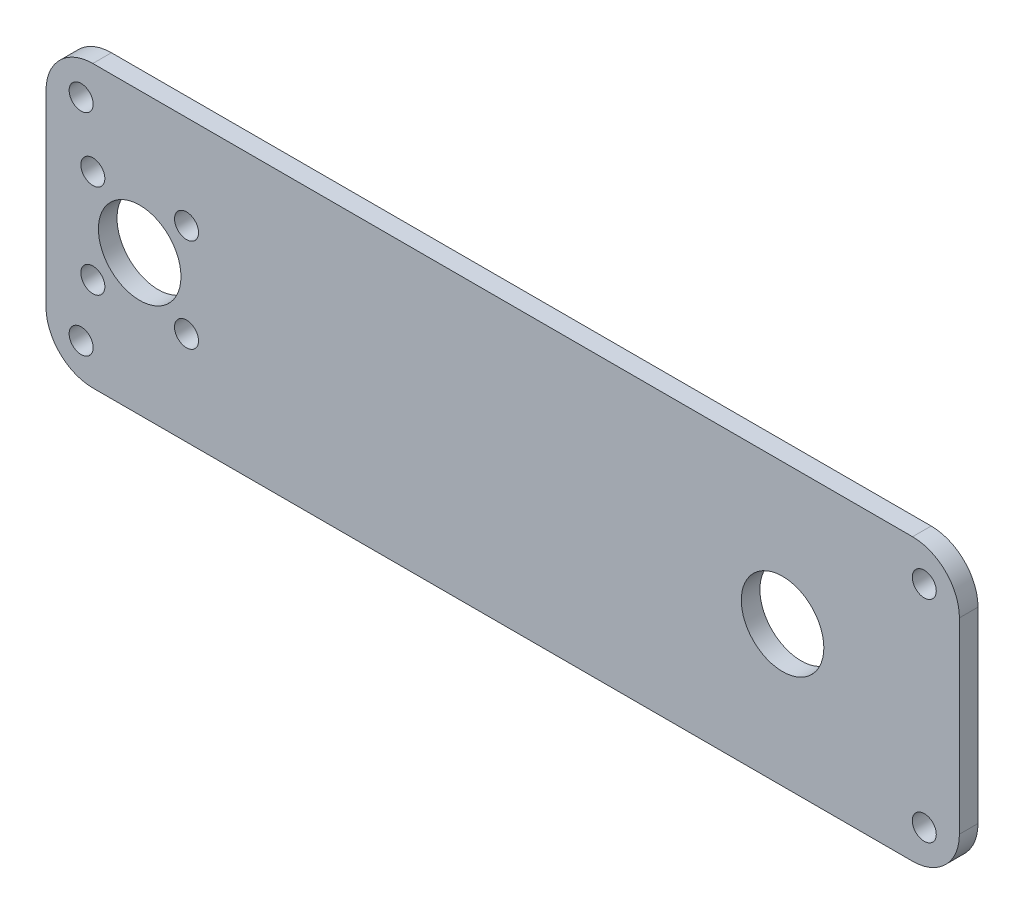
ISO-10303-21;
HEADER;
FILE_DESCRIPTION(('STEP AP214'),'2;1');
FILE_NAME('part.step','',(''),(''),'','','');
FILE_SCHEMA(('AUTOMOTIVE_DESIGN { 1 0 10303 214 1 1 1 1 }'));
ENDSEC;
DATA;
#1=APPLICATION_CONTEXT('core data for automotive mechanical design processes');
#2=APPLICATION_PROTOCOL_DEFINITION('international standard','automotive_design',2000,#1);
#3=PRODUCT_CONTEXT('',#1,'mechanical');
#4=PRODUCT('Part','Part','',(#3));
#5=PRODUCT_RELATED_PRODUCT_CATEGORY('part','',(#4));
#6=PRODUCT_DEFINITION_FORMATION('','',#4);
#7=PRODUCT_DEFINITION_CONTEXT('part definition',#1,'design');
#8=PRODUCT_DEFINITION('design','',#6,#7);
#9=PRODUCT_DEFINITION_SHAPE('','',#8);
#10=(LENGTH_UNIT() NAMED_UNIT(*) SI_UNIT(.MILLI.,.METRE.));
#11=(NAMED_UNIT(*) PLANE_ANGLE_UNIT() SI_UNIT($,.RADIAN.));
#12=(NAMED_UNIT(*) SI_UNIT($,.STERADIAN.) SOLID_ANGLE_UNIT());
#13=UNCERTAINTY_MEASURE_WITH_UNIT(LENGTH_MEASURE(1.E-05),#10,'distance_accuracy_value','');
#14=(GEOMETRIC_REPRESENTATION_CONTEXT(3) GLOBAL_UNCERTAINTY_ASSIGNED_CONTEXT((#13)) GLOBAL_UNIT_ASSIGNED_CONTEXT((#10,
#11,#12)) REPRESENTATION_CONTEXT('',''));
#15=CARTESIAN_POINT('',(0.,0.,0.));
#16=DIRECTION('',(0.,0.,1.));
#17=DIRECTION('',(1.,0.,0.));
#18=AXIS2_PLACEMENT_3D('',#15,#16,#17);
#19=CARTESIAN_POINT('',(0.,24.,3.175));
#20=DIRECTION('',(0.,-1.,0.));
#21=DIRECTION('',(1.,0.,0.));
#22=AXIS2_PLACEMENT_3D('',#19,#20,#21);
#23=PLANE('',#22);
#24=DIRECTION('',(-1.,0.,0.));
#25=VECTOR('',#24,1.);
#26=CARTESIAN_POINT('',(0.,24.,3.175));
#27=LINE('',#26,#25);
#28=CARTESIAN_POINT('',(70.,24.,3.175));
#29=VERTEX_POINT('',#28);
#30=CARTESIAN_POINT('',(-70.,24.,3.175));
#31=VERTEX_POINT('',#30);
#32=EDGE_CURVE('E198',#29,#31,#27,.T.);
#33=ORIENTED_EDGE('',*,*,#32,.F.);
#34=DIRECTION('',(0.,0.,-1.));
#35=VECTOR('',#34,1.);
#36=CARTESIAN_POINT('',(70.,24.,0.));
#37=LINE('',#36,#35);
#38=CARTESIAN_POINT('',(70.,24.,0.));
#39=VERTEX_POINT('',#38);
#40=EDGE_CURVE('E153',#29,#39,#37,.T.);
#41=ORIENTED_EDGE('',*,*,#40,.T.);
#42=DIRECTION('',(-1.,0.,0.));
#43=VECTOR('',#42,1.);
#44=CARTESIAN_POINT('',(0.,24.,0.));
#45=LINE('',#44,#43);
#46=CARTESIAN_POINT('',(-70.,24.,0.));
#47=VERTEX_POINT('',#46);
#48=EDGE_CURVE('E107',#39,#47,#45,.T.);
#49=ORIENTED_EDGE('',*,*,#48,.T.);
#50=DIRECTION('',(0.,0.,-1.));
#51=VECTOR('',#50,1.);
#52=CARTESIAN_POINT('',(-70.,24.,3.175));
#53=LINE('',#52,#51);
#54=EDGE_CURVE('E151',#47,#31,#53,.F.);
#55=ORIENTED_EDGE('',*,*,#54,.T.);
#56=EDGE_LOOP('',(#33,#41,#49,#55));
#57=FACE_BOUND('',#56,.T.);
#58=ADVANCED_FACE('F37',(#57),#23,.F.);
#59=CARTESIAN_POINT('',(-78.,0.,3.175));
#60=DIRECTION('',(1.,0.,0.));
#61=DIRECTION('',(0.,1.,0.));
#62=AXIS2_PLACEMENT_3D('',#59,#60,#61);
#63=PLANE('',#62);
#64=DIRECTION('',(0.,-1.,0.));
#65=VECTOR('',#64,1.);
#66=CARTESIAN_POINT('',(-78.,0.,0.));
#67=LINE('',#66,#65);
#68=CARTESIAN_POINT('',(-78.,16.,0.));
#69=VERTEX_POINT('',#68);
#70=CARTESIAN_POINT('',(-78.,-16.,0.));
#71=VERTEX_POINT('',#70);
#72=EDGE_CURVE('E158',#69,#71,#67,.T.);
#73=ORIENTED_EDGE('',*,*,#72,.T.);
#74=DIRECTION('',(0.,0.,-1.));
#75=VECTOR('',#74,1.);
#76=CARTESIAN_POINT('',(-78.,-16.,3.175));
#77=LINE('',#76,#75);
#78=CARTESIAN_POINT('',(-78.,-16.,3.175));
#79=VERTEX_POINT('',#78);
#80=EDGE_CURVE('E11',#71,#79,#77,.F.);
#81=ORIENTED_EDGE('',*,*,#80,.T.);
#82=DIRECTION('',(0.,-1.,0.));
#83=VECTOR('',#82,1.);
#84=CARTESIAN_POINT('',(-78.,0.,3.175));
#85=LINE('',#84,#83);
#86=CARTESIAN_POINT('',(-78.,16.,3.175));
#87=VERTEX_POINT('',#86);
#88=EDGE_CURVE('E159',#87,#79,#85,.T.);
#89=ORIENTED_EDGE('',*,*,#88,.F.);
#90=DIRECTION('',(0.,0.,-1.));
#91=VECTOR('',#90,1.);
#92=CARTESIAN_POINT('',(-78.,16.,3.175));
#93=LINE('',#92,#91);
#94=EDGE_CURVE('E45',#87,#69,#93,.T.);
#95=ORIENTED_EDGE('',*,*,#94,.T.);
#96=EDGE_LOOP('',(#73,#81,#89,#95));
#97=FACE_BOUND('',#96,.T.);
#98=ADVANCED_FACE('F157',(#97),#63,.F.);
#99=CARTESIAN_POINT('',(0.,-24.,3.175));
#100=DIRECTION('',(0.,-1.,0.));
#101=DIRECTION('',(1.,0.,0.));
#102=AXIS2_PLACEMENT_3D('',#99,#100,#101);
#103=PLANE('',#102);
#104=DIRECTION('',(-1.,0.,0.));
#105=VECTOR('',#104,1.);
#106=CARTESIAN_POINT('',(0.,-24.,0.));
#107=LINE('',#106,#105);
#108=CARTESIAN_POINT('',(70.,-24.,0.));
#109=VERTEX_POINT('',#108);
#110=CARTESIAN_POINT('',(-70.,-24.,0.));
#111=VERTEX_POINT('',#110);
#112=EDGE_CURVE('E124',#109,#111,#107,.T.);
#113=ORIENTED_EDGE('',*,*,#112,.F.);
#114=DIRECTION('',(0.,0.,-1.));
#115=VECTOR('',#114,1.);
#116=CARTESIAN_POINT('',(70.,-24.,3.175));
#117=LINE('',#116,#115);
#118=CARTESIAN_POINT('',(70.,-24.,3.175));
#119=VERTEX_POINT('',#118);
#120=EDGE_CURVE('E143',#109,#119,#117,.F.);
#121=ORIENTED_EDGE('',*,*,#120,.T.);
#122=DIRECTION('',(-1.,0.,0.));
#123=VECTOR('',#122,1.);
#124=CARTESIAN_POINT('',(0.,-24.,3.175));
#125=LINE('',#124,#123);
#126=CARTESIAN_POINT('',(-70.,-24.,3.175));
#127=VERTEX_POINT('',#126);
#128=EDGE_CURVE('E133',#119,#127,#125,.T.);
#129=ORIENTED_EDGE('',*,*,#128,.T.);
#130=DIRECTION('',(0.,0.,-1.));
#131=VECTOR('',#130,1.);
#132=CARTESIAN_POINT('',(-70.,-24.,0.));
#133=LINE('',#132,#131);
#134=EDGE_CURVE('E140',#127,#111,#133,.T.);
#135=ORIENTED_EDGE('',*,*,#134,.T.);
#136=EDGE_LOOP('',(#113,#121,#129,#135));
#137=FACE_BOUND('',#136,.T.);
#138=ADVANCED_FACE('F263',(#137),#103,.T.);
#139=CARTESIAN_POINT('',(-69.9999999999337,7.99999999999999,3.175));
#140=DIRECTION('',(0.,0.,-1.));
#141=DIRECTION('',(-1.,0.,0.));
#142=AXIS2_PLACEMENT_3D('',#139,#140,#141);
#143=CYLINDRICAL_SURFACE('',#142,2.04999999999999);
#144=CARTESIAN_POINT('',(-69.9999999999337,7.99999999999999,3.175));
#145=DIRECTION('',(0.,0.,1.));
#146=DIRECTION('',(1.,0.,0.));
#147=AXIS2_PLACEMENT_3D('',#144,#145,#146);
#148=CIRCLE('',#147,2.04999999999999);
#149=CARTESIAN_POINT('',(-67.9499999999337,7.99999999999999,3.175));
#150=VERTEX_POINT('',#149);
#151=EDGE_CURVE('E200',#150,#150,#148,.T.);
#152=ORIENTED_EDGE('',*,*,#151,.T.);
#153=EDGE_LOOP('',(#152));
#154=FACE_BOUND('',#153,.T.);
#155=CARTESIAN_POINT('',(-69.9999999999337,7.99999999999999,0.));
#156=DIRECTION('',(0.,0.,1.));
#157=DIRECTION('',(1.,0.,0.));
#158=AXIS2_PLACEMENT_3D('',#155,#156,#157);
#159=CIRCLE('',#158,2.04999999999999);
#160=CARTESIAN_POINT('',(-67.9499999999337,7.99999999999999,0.));
#161=VERTEX_POINT('',#160);
#162=EDGE_CURVE('E163',#161,#161,#159,.T.);
#163=ORIENTED_EDGE('',*,*,#162,.F.);
#164=EDGE_LOOP('',(#163));
#165=FACE_BOUND('',#164,.T.);
#166=ADVANCED_FACE('F282',(#154,#165),#143,.F.);
#167=CARTESIAN_POINT('',(-53.9999999999337,7.99999999999999,3.175));
#168=DIRECTION('',(0.,0.,-1.));
#169=DIRECTION('',(-1.,0.,0.));
#170=AXIS2_PLACEMENT_3D('',#167,#168,#169);
#171=CYLINDRICAL_SURFACE('',#170,2.04999999999999);
#172=CARTESIAN_POINT('',(-53.9999999999337,7.99999999999999,3.175));
#173=DIRECTION('',(0.,0.,1.));
#174=DIRECTION('',(1.,0.,0.));
#175=AXIS2_PLACEMENT_3D('',#172,#173,#174);
#176=CIRCLE('',#175,2.04999999999999);
#177=CARTESIAN_POINT('',(-51.9499999999337,7.99999999999999,3.175));
#178=VERTEX_POINT('',#177);
#179=EDGE_CURVE('E203',#178,#178,#176,.T.);
#180=ORIENTED_EDGE('',*,*,#179,.T.);
#181=EDGE_LOOP('',(#180));
#182=FACE_BOUND('',#181,.T.);
#183=CARTESIAN_POINT('',(-53.9999999999337,7.99999999999999,0.));
#184=DIRECTION('',(0.,0.,1.));
#185=DIRECTION('',(1.,0.,0.));
#186=AXIS2_PLACEMENT_3D('',#183,#184,#185);
#187=CIRCLE('',#186,2.04999999999999);
#188=CARTESIAN_POINT('',(-51.9499999999337,7.99999999999999,0.));
#189=VERTEX_POINT('',#188);
#190=EDGE_CURVE('E168',#189,#189,#187,.T.);
#191=ORIENTED_EDGE('',*,*,#190,.F.);
#192=EDGE_LOOP('',(#191));
#193=FACE_BOUND('',#192,.T.);
#194=ADVANCED_FACE('F285',(#182,#193),#171,.F.);
#195=CARTESIAN_POINT('',(-53.9999999999337,-8.00000000000001,3.175));
#196=DIRECTION('',(0.,0.,-1.));
#197=DIRECTION('',(-1.,0.,0.));
#198=AXIS2_PLACEMENT_3D('',#195,#196,#197);
#199=CYLINDRICAL_SURFACE('',#198,2.04999999999999);
#200=CARTESIAN_POINT('',(-53.9999999999337,-8.00000000000001,3.175));
#201=DIRECTION('',(0.,0.,1.));
#202=DIRECTION('',(1.,0.,0.));
#203=AXIS2_PLACEMENT_3D('',#200,#201,#202);
#204=CIRCLE('',#203,2.04999999999999);
#205=CARTESIAN_POINT('',(-51.9499999999337,-8.00000000000001,3.175));
#206=VERTEX_POINT('',#205);
#207=EDGE_CURVE('E206',#206,#206,#204,.T.);
#208=ORIENTED_EDGE('',*,*,#207,.T.);
#209=EDGE_LOOP('',(#208));
#210=FACE_BOUND('',#209,.T.);
#211=CARTESIAN_POINT('',(-53.9999999999337,-8.00000000000001,0.));
#212=DIRECTION('',(0.,0.,1.));
#213=DIRECTION('',(1.,0.,0.));
#214=AXIS2_PLACEMENT_3D('',#211,#212,#213);
#215=CIRCLE('',#214,2.04999999999999);
#216=CARTESIAN_POINT('',(-51.9499999999337,-8.00000000000001,0.));
#217=VERTEX_POINT('',#216);
#218=EDGE_CURVE('E171',#217,#217,#215,.T.);
#219=ORIENTED_EDGE('',*,*,#218,.F.);
#220=EDGE_LOOP('',(#219));
#221=FACE_BOUND('',#220,.T.);
#222=ADVANCED_FACE('F289',(#210,#221),#199,.F.);
#223=CARTESIAN_POINT('',(-69.9999999999337,-8.00000000000001,3.175));
#224=DIRECTION('',(0.,0.,-1.));
#225=DIRECTION('',(-1.,0.,0.));
#226=AXIS2_PLACEMENT_3D('',#223,#224,#225);
#227=CYLINDRICAL_SURFACE('',#226,2.04999999999999);
#228=CARTESIAN_POINT('',(-69.9999999999337,-8.00000000000001,3.175));
#229=DIRECTION('',(0.,0.,1.));
#230=DIRECTION('',(1.,0.,0.));
#231=AXIS2_PLACEMENT_3D('',#228,#229,#230);
#232=CIRCLE('',#231,2.04999999999999);
#233=CARTESIAN_POINT('',(-67.9499999999337,-8.00000000000001,3.175));
#234=VERTEX_POINT('',#233);
#235=EDGE_CURVE('E209',#234,#234,#232,.T.);
#236=ORIENTED_EDGE('',*,*,#235,.T.);
#237=EDGE_LOOP('',(#236));
#238=FACE_BOUND('',#237,.T.);
#239=CARTESIAN_POINT('',(-69.9999999999337,-8.00000000000001,0.));
#240=DIRECTION('',(0.,0.,1.));
#241=DIRECTION('',(1.,0.,0.));
#242=AXIS2_PLACEMENT_3D('',#239,#240,#241);
#243=CIRCLE('',#242,2.04999999999999);
#244=CARTESIAN_POINT('',(-67.9499999999337,-8.00000000000001,0.));
#245=VERTEX_POINT('',#244);
#246=EDGE_CURVE('E174',#245,#245,#243,.T.);
#247=ORIENTED_EDGE('',*,*,#246,.F.);
#248=EDGE_LOOP('',(#247));
#249=FACE_BOUND('',#248,.T.);
#250=ADVANCED_FACE('F293',(#238,#249),#227,.F.);
#251=CARTESIAN_POINT('',(47.7955803165425,2.02569696345008E-10,3.175));
#252=DIRECTION('',(0.,0.,-1.));
#253=DIRECTION('',(-1.,0.,0.));
#254=AXIS2_PLACEMENT_3D('',#251,#252,#253);
#255=CYLINDRICAL_SURFACE('',#254,7.05);
#256=CARTESIAN_POINT('',(47.7955803165425,2.02569696345008E-10,3.175));
#257=DIRECTION('',(0.,0.,1.));
#258=DIRECTION('',(1.,0.,0.));
#259=AXIS2_PLACEMENT_3D('',#256,#257,#258);
#260=CIRCLE('',#259,7.05);
#261=CARTESIAN_POINT('',(54.8455803165425,2.02569696345008E-10,3.175));
#262=VERTEX_POINT('',#261);
#263=EDGE_CURVE('E212',#262,#262,#260,.T.);
#264=ORIENTED_EDGE('',*,*,#263,.T.);
#265=EDGE_LOOP('',(#264));
#266=FACE_BOUND('',#265,.T.);
#267=CARTESIAN_POINT('',(47.7955803165425,2.02569696345008E-10,0.));
#268=DIRECTION('',(0.,0.,1.));
#269=DIRECTION('',(1.,0.,0.));
#270=AXIS2_PLACEMENT_3D('',#267,#268,#269);
#271=CIRCLE('',#270,7.05);
#272=CARTESIAN_POINT('',(54.8455803165425,2.02569696345008E-10,0.));
#273=VERTEX_POINT('',#272);
#274=EDGE_CURVE('E177',#273,#273,#271,.T.);
#275=ORIENTED_EDGE('',*,*,#274,.F.);
#276=EDGE_LOOP('',(#275));
#277=FACE_BOUND('',#276,.T.);
#278=ADVANCED_FACE('F297',(#266,#277),#255,.F.);
#279=CARTESIAN_POINT('',(-61.9999999999337,0.,3.175));
#280=DIRECTION('',(0.,0.,-1.));
#281=DIRECTION('',(-1.,0.,0.));
#282=AXIS2_PLACEMENT_3D('',#279,#280,#281);
#283=CYLINDRICAL_SURFACE('',#282,7.05);
#284=CARTESIAN_POINT('',(-61.9999999999337,0.,3.175));
#285=DIRECTION('',(0.,0.,1.));
#286=DIRECTION('',(1.,0.,0.));
#287=AXIS2_PLACEMENT_3D('',#284,#285,#286);
#288=CIRCLE('',#287,7.05);
#289=CARTESIAN_POINT('',(-54.9499999999337,0.,3.175));
#290=VERTEX_POINT('',#289);
#291=EDGE_CURVE('E215',#290,#290,#288,.T.);
#292=ORIENTED_EDGE('',*,*,#291,.T.);
#293=EDGE_LOOP('',(#292));
#294=FACE_BOUND('',#293,.T.);
#295=CARTESIAN_POINT('',(-61.9999999999337,0.,0.));
#296=DIRECTION('',(0.,0.,1.));
#297=DIRECTION('',(1.,0.,0.));
#298=AXIS2_PLACEMENT_3D('',#295,#296,#297);
#299=CIRCLE('',#298,7.05);
#300=CARTESIAN_POINT('',(-54.9499999999337,0.,0.));
#301=VERTEX_POINT('',#300);
#302=EDGE_CURVE('E180',#301,#301,#299,.T.);
#303=ORIENTED_EDGE('',*,*,#302,.F.);
#304=EDGE_LOOP('',(#303));
#305=FACE_BOUND('',#304,.T.);
#306=ADVANCED_FACE('F301',(#294,#305),#283,.F.);
#307=CARTESIAN_POINT('',(72.,18.,3.175));
#308=DIRECTION('',(0.,0.,-1.));
#309=DIRECTION('',(-1.,0.,0.));
#310=AXIS2_PLACEMENT_3D('',#307,#308,#309);
#311=CYLINDRICAL_SURFACE('',#310,2.04999999999999);
#312=CARTESIAN_POINT('',(72.,18.,3.175));
#313=DIRECTION('',(0.,0.,1.));
#314=DIRECTION('',(1.,0.,0.));
#315=AXIS2_PLACEMENT_3D('',#312,#313,#314);
#316=CIRCLE('',#315,2.04999999999999);
#317=CARTESIAN_POINT('',(74.05,18.,3.175));
#318=VERTEX_POINT('',#317);
#319=EDGE_CURVE('E218',#318,#318,#316,.T.);
#320=ORIENTED_EDGE('',*,*,#319,.T.);
#321=EDGE_LOOP('',(#320));
#322=FACE_BOUND('',#321,.T.);
#323=CARTESIAN_POINT('',(72.,18.,0.));
#324=DIRECTION('',(0.,0.,1.));
#325=DIRECTION('',(1.,0.,0.));
#326=AXIS2_PLACEMENT_3D('',#323,#324,#325);
#327=CIRCLE('',#326,2.04999999999999);
#328=CARTESIAN_POINT('',(74.05,18.,0.));
#329=VERTEX_POINT('',#328);
#330=EDGE_CURVE('E183',#329,#329,#327,.T.);
#331=ORIENTED_EDGE('',*,*,#330,.F.);
#332=EDGE_LOOP('',(#331));
#333=FACE_BOUND('',#332,.T.);
#334=ADVANCED_FACE('F305',(#322,#333),#311,.F.);
#335=CARTESIAN_POINT('',(72.,-18.,3.175));
#336=DIRECTION('',(0.,0.,-1.));
#337=DIRECTION('',(-1.,0.,0.));
#338=AXIS2_PLACEMENT_3D('',#335,#336,#337);
#339=CYLINDRICAL_SURFACE('',#338,2.04999999999999);
#340=CARTESIAN_POINT('',(72.,-18.,3.175));
#341=DIRECTION('',(0.,0.,1.));
#342=DIRECTION('',(1.,0.,0.));
#343=AXIS2_PLACEMENT_3D('',#340,#341,#342);
#344=CIRCLE('',#343,2.04999999999999);
#345=CARTESIAN_POINT('',(74.05,-18.,3.175));
#346=VERTEX_POINT('',#345);
#347=EDGE_CURVE('E221',#346,#346,#344,.T.);
#348=ORIENTED_EDGE('',*,*,#347,.T.);
#349=EDGE_LOOP('',(#348));
#350=FACE_BOUND('',#349,.T.);
#351=CARTESIAN_POINT('',(72.,-18.,0.));
#352=DIRECTION('',(0.,0.,1.));
#353=DIRECTION('',(1.,0.,0.));
#354=AXIS2_PLACEMENT_3D('',#351,#352,#353);
#355=CIRCLE('',#354,2.04999999999999);
#356=CARTESIAN_POINT('',(74.05,-18.,0.));
#357=VERTEX_POINT('',#356);
#358=EDGE_CURVE('E186',#357,#357,#355,.T.);
#359=ORIENTED_EDGE('',*,*,#358,.F.);
#360=EDGE_LOOP('',(#359));
#361=FACE_BOUND('',#360,.T.);
#362=ADVANCED_FACE('F309',(#350,#361),#339,.F.);
#363=CARTESIAN_POINT('',(-72.,-18.,3.175));
#364=DIRECTION('',(0.,0.,-1.));
#365=DIRECTION('',(-1.,0.,0.));
#366=AXIS2_PLACEMENT_3D('',#363,#364,#365);
#367=CYLINDRICAL_SURFACE('',#366,2.04999999999999);
#368=CARTESIAN_POINT('',(-72.,-18.,3.175));
#369=DIRECTION('',(0.,0.,1.));
#370=DIRECTION('',(1.,0.,0.));
#371=AXIS2_PLACEMENT_3D('',#368,#369,#370);
#372=CIRCLE('',#371,2.04999999999999);
#373=CARTESIAN_POINT('',(-69.95,-18.,3.175));
#374=VERTEX_POINT('',#373);
#375=EDGE_CURVE('E224',#374,#374,#372,.T.);
#376=ORIENTED_EDGE('',*,*,#375,.T.);
#377=EDGE_LOOP('',(#376));
#378=FACE_BOUND('',#377,.T.);
#379=CARTESIAN_POINT('',(-72.,-18.,0.));
#380=DIRECTION('',(0.,0.,1.));
#381=DIRECTION('',(1.,0.,0.));
#382=AXIS2_PLACEMENT_3D('',#379,#380,#381);
#383=CIRCLE('',#382,2.04999999999999);
#384=CARTESIAN_POINT('',(-69.95,-18.,0.));
#385=VERTEX_POINT('',#384);
#386=EDGE_CURVE('E189',#385,#385,#383,.T.);
#387=ORIENTED_EDGE('',*,*,#386,.F.);
#388=EDGE_LOOP('',(#387));
#389=FACE_BOUND('',#388,.T.);
#390=ADVANCED_FACE('F313',(#378,#389),#367,.F.);
#391=CARTESIAN_POINT('',(-72.,18.,3.175));
#392=DIRECTION('',(0.,0.,-1.));
#393=DIRECTION('',(-1.,0.,0.));
#394=AXIS2_PLACEMENT_3D('',#391,#392,#393);
#395=CYLINDRICAL_SURFACE('',#394,2.04999999999999);
#396=CARTESIAN_POINT('',(-72.,18.,3.175));
#397=DIRECTION('',(0.,0.,1.));
#398=DIRECTION('',(1.,0.,0.));
#399=AXIS2_PLACEMENT_3D('',#396,#397,#398);
#400=CIRCLE('',#399,2.04999999999999);
#401=CARTESIAN_POINT('',(-69.95,18.,3.175));
#402=VERTEX_POINT('',#401);
#403=EDGE_CURVE('E123',#402,#402,#400,.T.);
#404=ORIENTED_EDGE('',*,*,#403,.T.);
#405=EDGE_LOOP('',(#404));
#406=FACE_BOUND('',#405,.T.);
#407=CARTESIAN_POINT('',(-72.,18.,0.));
#408=DIRECTION('',(0.,0.,1.));
#409=DIRECTION('',(1.,0.,0.));
#410=AXIS2_PLACEMENT_3D('',#407,#408,#409);
#411=CIRCLE('',#410,2.04999999999999);
#412=CARTESIAN_POINT('',(-69.95,18.,0.));
#413=VERTEX_POINT('',#412);
#414=EDGE_CURVE('E192',#413,#413,#411,.T.);
#415=ORIENTED_EDGE('',*,*,#414,.F.);
#416=EDGE_LOOP('',(#415));
#417=FACE_BOUND('',#416,.T.);
#418=ADVANCED_FACE('F230',(#406,#417),#395,.F.);
#419=CARTESIAN_POINT('',(78.,0.,3.175));
#420=DIRECTION('',(1.,0.,0.));
#421=DIRECTION('',(0.,0.,-1.));
#422=AXIS2_PLACEMENT_3D('',#419,#420,#421);
#423=PLANE('',#422);
#424=DIRECTION('',(0.,-1.,0.));
#425=VECTOR('',#424,1.);
#426=CARTESIAN_POINT('',(78.,0.,3.175));
#427=LINE('',#426,#425);
#428=CARTESIAN_POINT('',(78.,16.,3.175));
#429=VERTEX_POINT('',#428);
#430=CARTESIAN_POINT('',(78.,-16.,3.175));
#431=VERTEX_POINT('',#430);
#432=EDGE_CURVE('E129',#429,#431,#427,.T.);
#433=ORIENTED_EDGE('',*,*,#432,.T.);
#434=DIRECTION('',(0.,0.,-1.));
#435=VECTOR('',#434,1.);
#436=CARTESIAN_POINT('',(78.,-16.,3.175));
#437=LINE('',#436,#435);
#438=CARTESIAN_POINT('',(78.,-16.,0.));
#439=VERTEX_POINT('',#438);
#440=EDGE_CURVE('E122',#431,#439,#437,.T.);
#441=ORIENTED_EDGE('',*,*,#440,.T.);
#442=DIRECTION('',(0.,-1.,0.));
#443=VECTOR('',#442,1.);
#444=CARTESIAN_POINT('',(78.,0.,0.));
#445=LINE('',#444,#443);
#446=CARTESIAN_POINT('',(78.,16.,0.));
#447=VERTEX_POINT('',#446);
#448=EDGE_CURVE('E105',#447,#439,#445,.T.);
#449=ORIENTED_EDGE('',*,*,#448,.F.);
#450=DIRECTION('',(0.,0.,-1.));
#451=VECTOR('',#450,1.);
#452=CARTESIAN_POINT('',(78.,16.,3.175));
#453=LINE('',#452,#451);
#454=EDGE_CURVE('E119',#447,#429,#453,.F.);
#455=ORIENTED_EDGE('',*,*,#454,.T.);
#456=EDGE_LOOP('',(#433,#441,#449,#455));
#457=FACE_BOUND('',#456,.T.);
#458=ADVANCED_FACE('F118',(#457),#423,.T.);
#459=CARTESIAN_POINT('',(0.,0.,3.175));
#460=DIRECTION('',(0.,0.,1.));
#461=DIRECTION('',(1.,0.,0.));
#462=AXIS2_PLACEMENT_3D('',#459,#460,#461);
#463=PLANE('',#462);
#464=ORIENTED_EDGE('',*,*,#403,.F.);
#465=EDGE_LOOP('',(#464));
#466=FACE_BOUND('',#465,.T.);
#467=ORIENTED_EDGE('',*,*,#375,.F.);
#468=EDGE_LOOP('',(#467));
#469=FACE_BOUND('',#468,.T.);
#470=ORIENTED_EDGE('',*,*,#347,.F.);
#471=EDGE_LOOP('',(#470));
#472=FACE_BOUND('',#471,.T.);
#473=ORIENTED_EDGE('',*,*,#319,.F.);
#474=EDGE_LOOP('',(#473));
#475=FACE_BOUND('',#474,.T.);
#476=ORIENTED_EDGE('',*,*,#291,.F.);
#477=EDGE_LOOP('',(#476));
#478=FACE_BOUND('',#477,.T.);
#479=ORIENTED_EDGE('',*,*,#263,.F.);
#480=EDGE_LOOP('',(#479));
#481=FACE_BOUND('',#480,.T.);
#482=ORIENTED_EDGE('',*,*,#235,.F.);
#483=EDGE_LOOP('',(#482));
#484=FACE_BOUND('',#483,.T.);
#485=ORIENTED_EDGE('',*,*,#207,.F.);
#486=EDGE_LOOP('',(#485));
#487=FACE_BOUND('',#486,.T.);
#488=ORIENTED_EDGE('',*,*,#179,.F.);
#489=EDGE_LOOP('',(#488));
#490=FACE_BOUND('',#489,.T.);
#491=ORIENTED_EDGE('',*,*,#151,.F.);
#492=EDGE_LOOP('',(#491));
#493=FACE_BOUND('',#492,.T.);
#494=ORIENTED_EDGE('',*,*,#128,.F.);
#495=CARTESIAN_POINT('',(70.,-16.,3.175));
#496=DIRECTION('',(0.,0.,1.));
#497=DIRECTION('',(1.,0.,0.));
#498=AXIS2_PLACEMENT_3D('',#495,#496,#497);
#499=CIRCLE('',#498,8.);
#500=EDGE_CURVE('E149',#119,#431,#499,.T.);
#501=ORIENTED_EDGE('',*,*,#500,.T.);
#502=ORIENTED_EDGE('',*,*,#432,.F.);
#503=CARTESIAN_POINT('',(70.,16.,3.175));
#504=DIRECTION('',(0.,0.,1.));
#505=DIRECTION('',(1.,0.,0.));
#506=AXIS2_PLACEMENT_3D('',#503,#504,#505);
#507=CIRCLE('',#506,8.);
#508=EDGE_CURVE('E128',#429,#29,#507,.T.);
#509=ORIENTED_EDGE('',*,*,#508,.T.);
#510=ORIENTED_EDGE('',*,*,#32,.T.);
#511=CARTESIAN_POINT('',(-70.,16.,3.175));
#512=DIRECTION('',(0.,0.,1.));
#513=DIRECTION('',(1.,0.,0.));
#514=AXIS2_PLACEMENT_3D('',#511,#512,#513);
#515=CIRCLE('',#514,8.);
#516=EDGE_CURVE('E57',#31,#87,#515,.T.);
#517=ORIENTED_EDGE('',*,*,#516,.T.);
#518=ORIENTED_EDGE('',*,*,#88,.T.);
#519=CARTESIAN_POINT('',(-70.,-16.,3.175));
#520=DIRECTION('',(0.,0.,1.));
#521=DIRECTION('',(1.,0.,0.));
#522=AXIS2_PLACEMENT_3D('',#519,#520,#521);
#523=CIRCLE('',#522,8.);
#524=EDGE_CURVE('E146',#79,#127,#523,.T.);
#525=ORIENTED_EDGE('',*,*,#524,.T.);
#526=EDGE_LOOP('',(#494,#501,#502,#509,#510,#517,#518,#525));
#527=FACE_BOUND('',#526,.T.);
#528=ADVANCED_FACE('F233',(#466,#469,#472,#475,#478,#481,#484,#487,#490,#493,#527),#463,.T.);
#529=CARTESIAN_POINT('',(0.,0.,0.));
#530=DIRECTION('',(0.,0.,1.));
#531=DIRECTION('',(1.,0.,0.));
#532=AXIS2_PLACEMENT_3D('',#529,#530,#531);
#533=PLANE('',#532);
#534=ORIENTED_EDGE('',*,*,#414,.T.);
#535=EDGE_LOOP('',(#534));
#536=FACE_BOUND('',#535,.T.);
#537=ORIENTED_EDGE('',*,*,#386,.T.);
#538=EDGE_LOOP('',(#537));
#539=FACE_BOUND('',#538,.T.);
#540=ORIENTED_EDGE('',*,*,#358,.T.);
#541=EDGE_LOOP('',(#540));
#542=FACE_BOUND('',#541,.T.);
#543=ORIENTED_EDGE('',*,*,#330,.T.);
#544=EDGE_LOOP('',(#543));
#545=FACE_BOUND('',#544,.T.);
#546=ORIENTED_EDGE('',*,*,#302,.T.);
#547=EDGE_LOOP('',(#546));
#548=FACE_BOUND('',#547,.T.);
#549=ORIENTED_EDGE('',*,*,#274,.T.);
#550=EDGE_LOOP('',(#549));
#551=FACE_BOUND('',#550,.T.);
#552=ORIENTED_EDGE('',*,*,#246,.T.);
#553=EDGE_LOOP('',(#552));
#554=FACE_BOUND('',#553,.T.);
#555=ORIENTED_EDGE('',*,*,#218,.T.);
#556=EDGE_LOOP('',(#555));
#557=FACE_BOUND('',#556,.T.);
#558=ORIENTED_EDGE('',*,*,#190,.T.);
#559=EDGE_LOOP('',(#558));
#560=FACE_BOUND('',#559,.T.);
#561=ORIENTED_EDGE('',*,*,#162,.T.);
#562=EDGE_LOOP('',(#561));
#563=FACE_BOUND('',#562,.T.);
#564=ORIENTED_EDGE('',*,*,#448,.T.);
#565=CARTESIAN_POINT('',(70.,-16.,0.));
#566=DIRECTION('',(0.,0.,1.));
#567=DIRECTION('',(1.,0.,0.));
#568=AXIS2_PLACEMENT_3D('',#565,#566,#567);
#569=CIRCLE('',#568,8.);
#570=EDGE_CURVE('E112',#439,#109,#569,.F.);
#571=ORIENTED_EDGE('',*,*,#570,.T.);
#572=ORIENTED_EDGE('',*,*,#112,.T.);
#573=CARTESIAN_POINT('',(-70.,-16.,0.));
#574=DIRECTION('',(0.,0.,1.));
#575=DIRECTION('',(1.,0.,0.));
#576=AXIS2_PLACEMENT_3D('',#573,#574,#575);
#577=CIRCLE('',#576,8.);
#578=EDGE_CURVE('E113',#111,#71,#577,.F.);
#579=ORIENTED_EDGE('',*,*,#578,.T.);
#580=ORIENTED_EDGE('',*,*,#72,.F.);
#581=CARTESIAN_POINT('',(-70.,16.,0.));
#582=DIRECTION('',(0.,0.,1.));
#583=DIRECTION('',(1.,0.,0.));
#584=AXIS2_PLACEMENT_3D('',#581,#582,#583);
#585=CIRCLE('',#584,8.);
#586=EDGE_CURVE('E131',#69,#47,#585,.F.);
#587=ORIENTED_EDGE('',*,*,#586,.T.);
#588=ORIENTED_EDGE('',*,*,#48,.F.);
#589=CARTESIAN_POINT('',(70.,16.,0.));
#590=DIRECTION('',(0.,0.,1.));
#591=DIRECTION('',(1.,0.,0.));
#592=AXIS2_PLACEMENT_3D('',#589,#590,#591);
#593=CIRCLE('',#592,8.);
#594=EDGE_CURVE('E102',#39,#447,#593,.F.);
#595=ORIENTED_EDGE('',*,*,#594,.T.);
#596=EDGE_LOOP('',(#564,#571,#572,#579,#580,#587,#588,#595));
#597=FACE_BOUND('',#596,.T.);
#598=ADVANCED_FACE('F104',(#536,#539,#542,#545,#548,#551,#554,#557,#560,#563,#597),#533,.F.);
#599=CARTESIAN_POINT('',(70.,-16.,3.175));
#600=DIRECTION('',(0.,0.,-1.));
#601=DIRECTION('',(-1.,0.,0.));
#602=AXIS2_PLACEMENT_3D('',#599,#600,#601);
#603=CYLINDRICAL_SURFACE('',#602,8.);
#604=ORIENTED_EDGE('',*,*,#500,.F.);
#605=ORIENTED_EDGE('',*,*,#120,.F.);
#606=ORIENTED_EDGE('',*,*,#570,.F.);
#607=ORIENTED_EDGE('',*,*,#440,.F.);
#608=EDGE_LOOP('',(#604,#605,#606,#607));
#609=FACE_BOUND('',#608,.T.);
#610=ADVANCED_FACE('F261',(#609),#603,.T.);
#611=CARTESIAN_POINT('',(70.,16.,3.175));
#612=DIRECTION('',(0.,0.,1.));
#613=DIRECTION('',(1.,0.,0.));
#614=AXIS2_PLACEMENT_3D('',#611,#612,#613);
#615=CYLINDRICAL_SURFACE('',#614,8.);
#616=ORIENTED_EDGE('',*,*,#508,.F.);
#617=ORIENTED_EDGE('',*,*,#454,.F.);
#618=ORIENTED_EDGE('',*,*,#594,.F.);
#619=ORIENTED_EDGE('',*,*,#40,.F.);
#620=EDGE_LOOP('',(#616,#617,#618,#619));
#621=FACE_BOUND('',#620,.T.);
#622=ADVANCED_FACE('F127',(#621),#615,.T.);
#623=CARTESIAN_POINT('',(-70.,-16.,3.175));
#624=DIRECTION('',(0.,0.,1.));
#625=DIRECTION('',(1.,0.,0.));
#626=AXIS2_PLACEMENT_3D('',#623,#624,#625);
#627=CYLINDRICAL_SURFACE('',#626,8.);
#628=ORIENTED_EDGE('',*,*,#524,.F.);
#629=ORIENTED_EDGE('',*,*,#80,.F.);
#630=ORIENTED_EDGE('',*,*,#578,.F.);
#631=ORIENTED_EDGE('',*,*,#134,.F.);
#632=EDGE_LOOP('',(#628,#629,#630,#631));
#633=FACE_BOUND('',#632,.T.);
#634=ADVANCED_FACE('F265',(#633),#627,.T.);
#635=CARTESIAN_POINT('',(-70.,16.,3.175));
#636=DIRECTION('',(0.,0.,-1.));
#637=DIRECTION('',(-1.,0.,0.));
#638=AXIS2_PLACEMENT_3D('',#635,#636,#637);
#639=CYLINDRICAL_SURFACE('',#638,8.);
#640=ORIENTED_EDGE('',*,*,#516,.F.);
#641=ORIENTED_EDGE('',*,*,#54,.F.);
#642=ORIENTED_EDGE('',*,*,#586,.F.);
#643=ORIENTED_EDGE('',*,*,#94,.F.);
#644=EDGE_LOOP('',(#640,#641,#642,#643));
#645=FACE_BOUND('',#644,.T.);
#646=ADVANCED_FACE('F39',(#645),#639,.T.);
#647=CLOSED_SHELL('',(#58,#98,#138,#166,#194,#222,#250,#278,#306,#334,#362,#390,#418,#458,#528,
#598,#610,#622,#634,#646));
#648=MANIFOLD_SOLID_BREP('B2',#647);
#649=ADVANCED_BREP_SHAPE_REPRESENTATION('',(#18,#648),#14);
#650=SHAPE_DEFINITION_REPRESENTATION(#9,#649);
ENDSEC;
END-ISO-10303-21;
